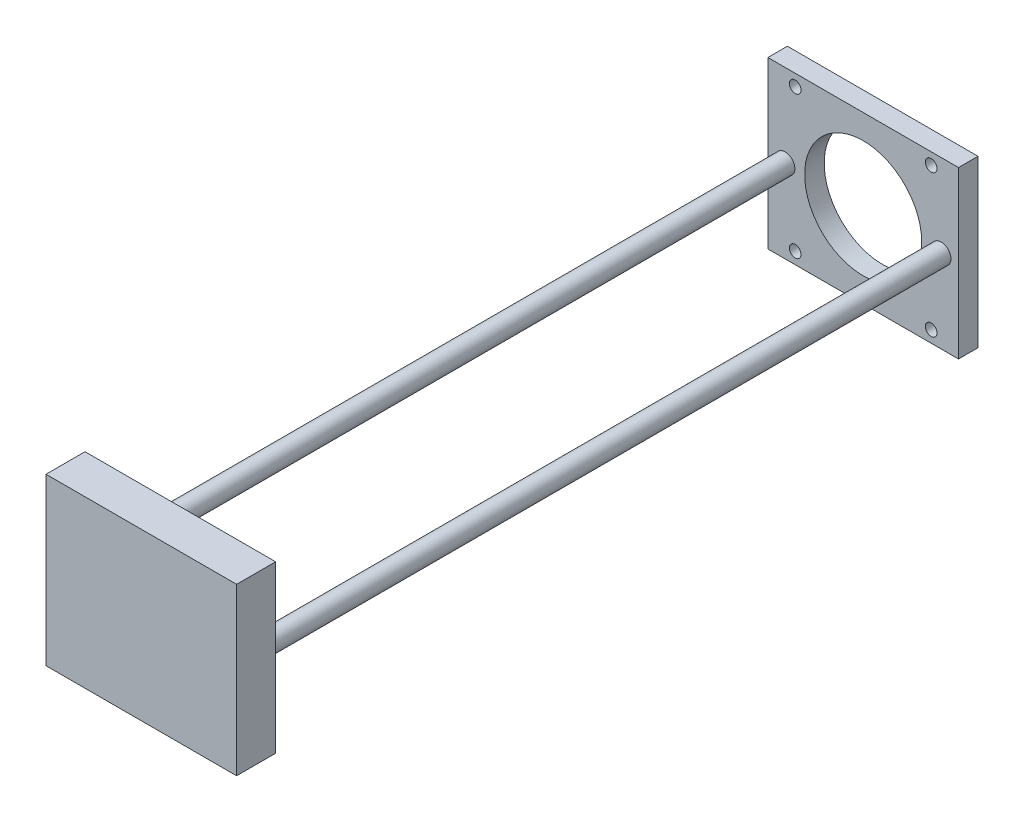
ISO-10303-21;
HEADER;
FILE_DESCRIPTION(('STEP AP214'),'2;1');
FILE_NAME('part.step','',(''),(''),'','','');
FILE_SCHEMA(('AUTOMOTIVE_DESIGN { 1 0 10303 214 1 1 1 1 }'));
ENDSEC;
DATA;
#1=APPLICATION_CONTEXT('core data for automotive mechanical design processes');
#2=APPLICATION_PROTOCOL_DEFINITION('international standard','automotive_design',2000,#1);
#3=PRODUCT_CONTEXT('',#1,'mechanical');
#4=PRODUCT('Part','Part','',(#3));
#5=PRODUCT_RELATED_PRODUCT_CATEGORY('part','',(#4));
#6=PRODUCT_DEFINITION_FORMATION('','',#4);
#7=PRODUCT_DEFINITION_CONTEXT('part definition',#1,'design');
#8=PRODUCT_DEFINITION('design','',#6,#7);
#9=PRODUCT_DEFINITION_SHAPE('','',#8);
#10=(LENGTH_UNIT() NAMED_UNIT(*) SI_UNIT(.MILLI.,.METRE.));
#11=(NAMED_UNIT(*) PLANE_ANGLE_UNIT() SI_UNIT($,.RADIAN.));
#12=(NAMED_UNIT(*) SI_UNIT($,.STERADIAN.) SOLID_ANGLE_UNIT());
#13=UNCERTAINTY_MEASURE_WITH_UNIT(LENGTH_MEASURE(1.E-05),#10,'distance_accuracy_value','');
#14=(GEOMETRIC_REPRESENTATION_CONTEXT(3) GLOBAL_UNCERTAINTY_ASSIGNED_CONTEXT((#13)) GLOBAL_UNIT_ASSIGNED_CONTEXT((#10,
#11,#12)) REPRESENTATION_CONTEXT('',''));
#15=CARTESIAN_POINT('',(0.,0.,0.));
#16=DIRECTION('',(0.,0.,1.));
#17=DIRECTION('',(1.,0.,0.));
#18=AXIS2_PLACEMENT_3D('',#15,#16,#17);
#19=CARTESIAN_POINT('',(0.,0.,10.));
#20=DIRECTION('',(0.,0.,1.));
#21=DIRECTION('',(1.,0.,0.));
#22=AXIS2_PLACEMENT_3D('',#19,#20,#21);
#23=PLANE('',#22);
#24=CARTESIAN_POINT('',(40.,0.,10.));
#25=DIRECTION('',(0.,0.,1.));
#26=DIRECTION('',(-1.,0.,0.));
#27=AXIS2_PLACEMENT_3D('',#24,#25,#26);
#28=CIRCLE('',#27,5.);
#29=CARTESIAN_POINT('',(35.,0.,10.));
#30=VERTEX_POINT('',#29);
#31=EDGE_CURVE('E146',#30,#30,#28,.T.);
#32=ORIENTED_EDGE('',*,*,#31,.F.);
#33=EDGE_LOOP('',(#32));
#34=FACE_BOUND('',#33,.T.);
#35=CARTESIAN_POINT('',(-40.,0.,10.));
#36=DIRECTION('',(0.,0.,1.));
#37=DIRECTION('',(1.,0.,0.));
#38=AXIS2_PLACEMENT_3D('',#35,#36,#37);
#39=CIRCLE('',#38,5.);
#40=CARTESIAN_POINT('',(-35.,0.,10.));
#41=VERTEX_POINT('',#40);
#42=EDGE_CURVE('E153',#41,#41,#39,.T.);
#43=ORIENTED_EDGE('',*,*,#42,.F.);
#44=EDGE_LOOP('',(#43));
#45=FACE_BOUND('',#44,.T.);
#46=CARTESIAN_POINT('',(34.85,-36.5,10.));
#47=DIRECTION('',(0.,0.,1.));
#48=DIRECTION('',(1.,0.,0.));
#49=AXIS2_PLACEMENT_3D('',#46,#47,#48);
#50=CIRCLE('',#49,3.);
#51=CARTESIAN_POINT('',(37.85,-36.5,10.));
#52=VERTEX_POINT('',#51);
#53=EDGE_CURVE('E167',#52,#52,#50,.T.);
#54=ORIENTED_EDGE('',*,*,#53,.F.);
#55=EDGE_LOOP('',(#54));
#56=FACE_BOUND('',#55,.T.);
#57=CARTESIAN_POINT('',(0.,0.,10.));
#58=DIRECTION('',(0.,0.,1.));
#59=DIRECTION('',(1.,0.,0.));
#60=AXIS2_PLACEMENT_3D('',#57,#58,#59);
#61=CIRCLE('',#60,30.);
#62=CARTESIAN_POINT('',(30.,0.,10.));
#63=VERTEX_POINT('',#62);
#64=EDGE_CURVE('E179',#63,#63,#61,.T.);
#65=ORIENTED_EDGE('',*,*,#64,.F.);
#66=EDGE_LOOP('',(#65));
#67=FACE_BOUND('',#66,.T.);
#68=DIRECTION('',(0.,-1.,0.));
#69=VECTOR('',#68,1.);
#70=CARTESIAN_POINT('',(-48.85,-42.5,10.));
#71=LINE('',#70,#69);
#72=CARTESIAN_POINT('',(-48.85,42.5,10.));
#73=VERTEX_POINT('',#72);
#74=CARTESIAN_POINT('',(-48.85,-42.5,10.));
#75=VERTEX_POINT('',#74);
#76=EDGE_CURVE('E191',#73,#75,#71,.T.);
#77=ORIENTED_EDGE('',*,*,#76,.T.);
#78=DIRECTION('',(1.,0.,0.));
#79=VECTOR('',#78,1.);
#80=CARTESIAN_POINT('',(48.85,-42.5,10.));
#81=LINE('',#80,#79);
#82=CARTESIAN_POINT('',(48.85,-42.5,10.));
#83=VERTEX_POINT('',#82);
#84=EDGE_CURVE('E91',#75,#83,#81,.T.);
#85=ORIENTED_EDGE('',*,*,#84,.T.);
#86=DIRECTION('',(0.,1.,0.));
#87=VECTOR('',#86,1.);
#88=CARTESIAN_POINT('',(48.85,-42.5,10.));
#89=LINE('',#88,#87);
#90=CARTESIAN_POINT('',(48.85,42.5,10.));
#91=VERTEX_POINT('',#90);
#92=EDGE_CURVE('E194',#83,#91,#89,.T.);
#93=ORIENTED_EDGE('',*,*,#92,.T.);
#94=DIRECTION('',(-1.,0.,0.));
#95=VECTOR('',#94,1.);
#96=CARTESIAN_POINT('',(48.85,42.5,10.));
#97=LINE('',#96,#95);
#98=EDGE_CURVE('E60',#91,#73,#97,.T.);
#99=ORIENTED_EDGE('',*,*,#98,.T.);
#100=EDGE_LOOP('',(#77,#85,#93,#99));
#101=FACE_BOUND('',#100,.T.);
#102=CARTESIAN_POINT('',(-34.85,36.5,10.));
#103=DIRECTION('',(0.,0.,1.));
#104=DIRECTION('',(1.,0.,0.));
#105=AXIS2_PLACEMENT_3D('',#102,#103,#104);
#106=CIRCLE('',#105,3.);
#107=CARTESIAN_POINT('',(-31.85,36.5,10.));
#108=VERTEX_POINT('',#107);
#109=EDGE_CURVE('E185',#108,#108,#106,.T.);
#110=ORIENTED_EDGE('',*,*,#109,.F.);
#111=EDGE_LOOP('',(#110));
#112=FACE_BOUND('',#111,.T.);
#113=CARTESIAN_POINT('',(34.8500000000001,36.5,10.));
#114=DIRECTION('',(0.,0.,1.));
#115=DIRECTION('',(-1.,0.,0.));
#116=AXIS2_PLACEMENT_3D('',#113,#114,#115);
#117=CIRCLE('',#116,3.);
#118=CARTESIAN_POINT('',(31.8500000000001,36.5,10.));
#119=VERTEX_POINT('',#118);
#120=EDGE_CURVE('E173',#119,#119,#117,.T.);
#121=ORIENTED_EDGE('',*,*,#120,.F.);
#122=EDGE_LOOP('',(#121));
#123=FACE_BOUND('',#122,.T.);
#124=CARTESIAN_POINT('',(-34.85,-36.5,10.));
#125=DIRECTION('',(0.,0.,1.));
#126=DIRECTION('',(-1.,0.,0.));
#127=AXIS2_PLACEMENT_3D('',#124,#125,#126);
#128=CIRCLE('',#127,3.);
#129=CARTESIAN_POINT('',(-37.85,-36.5,10.));
#130=VERTEX_POINT('',#129);
#131=EDGE_CURVE('E161',#130,#130,#128,.T.);
#132=ORIENTED_EDGE('',*,*,#131,.F.);
#133=EDGE_LOOP('',(#132));
#134=FACE_BOUND('',#133,.T.);
#135=ADVANCED_FACE('F43',(#34,#45,#56,#67,#101,#112,#123,#134),#23,.T.);
#136=CARTESIAN_POINT('',(0.,0.,0.));
#137=DIRECTION('',(0.,0.,1.));
#138=DIRECTION('',(1.,0.,0.));
#139=AXIS2_PLACEMENT_3D('',#136,#137,#138);
#140=PLANE('',#139);
#141=DIRECTION('',(0.,-1.,0.));
#142=VECTOR('',#141,1.);
#143=CARTESIAN_POINT('',(-48.85,-42.5,0.));
#144=LINE('',#143,#142);
#145=CARTESIAN_POINT('',(-48.85,42.5,0.));
#146=VERTEX_POINT('',#145);
#147=CARTESIAN_POINT('',(-48.85,-42.5,0.));
#148=VERTEX_POINT('',#147);
#149=EDGE_CURVE('E188',#146,#148,#144,.T.);
#150=ORIENTED_EDGE('',*,*,#149,.F.);
#151=DIRECTION('',(-1.,0.,0.));
#152=VECTOR('',#151,1.);
#153=CARTESIAN_POINT('',(48.85,42.5,0.));
#154=LINE('',#153,#152);
#155=CARTESIAN_POINT('',(48.85,42.5,0.));
#156=VERTEX_POINT('',#155);
#157=EDGE_CURVE('E84',#156,#146,#154,.T.);
#158=ORIENTED_EDGE('',*,*,#157,.F.);
#159=DIRECTION('',(0.,1.,0.));
#160=VECTOR('',#159,1.);
#161=CARTESIAN_POINT('',(48.85,-42.5,0.));
#162=LINE('',#161,#160);
#163=CARTESIAN_POINT('',(48.85,-42.5,0.));
#164=VERTEX_POINT('',#163);
#165=EDGE_CURVE('E78',#164,#156,#162,.T.);
#166=ORIENTED_EDGE('',*,*,#165,.F.);
#167=DIRECTION('',(1.,0.,0.));
#168=VECTOR('',#167,1.);
#169=CARTESIAN_POINT('',(48.85,-42.5,0.));
#170=LINE('',#169,#168);
#171=EDGE_CURVE('E200',#148,#164,#170,.T.);
#172=ORIENTED_EDGE('',*,*,#171,.F.);
#173=EDGE_LOOP('',(#150,#158,#166,#172));
#174=FACE_BOUND('',#173,.T.);
#175=CARTESIAN_POINT('',(-34.85,36.5,0.));
#176=DIRECTION('',(0.,0.,1.));
#177=DIRECTION('',(1.,0.,0.));
#178=AXIS2_PLACEMENT_3D('',#175,#176,#177);
#179=CIRCLE('',#178,3.);
#180=CARTESIAN_POINT('',(-31.85,36.5,0.));
#181=VERTEX_POINT('',#180);
#182=EDGE_CURVE('E182',#181,#181,#179,.T.);
#183=ORIENTED_EDGE('',*,*,#182,.T.);
#184=EDGE_LOOP('',(#183));
#185=FACE_BOUND('',#184,.T.);
#186=CARTESIAN_POINT('',(0.,0.,0.));
#187=DIRECTION('',(0.,0.,1.));
#188=DIRECTION('',(1.,0.,0.));
#189=AXIS2_PLACEMENT_3D('',#186,#187,#188);
#190=CIRCLE('',#189,30.);
#191=CARTESIAN_POINT('',(30.,0.,0.));
#192=VERTEX_POINT('',#191);
#193=EDGE_CURVE('E176',#192,#192,#190,.T.);
#194=ORIENTED_EDGE('',*,*,#193,.T.);
#195=EDGE_LOOP('',(#194));
#196=FACE_BOUND('',#195,.T.);
#197=CARTESIAN_POINT('',(34.8500000000001,36.5,0.));
#198=DIRECTION('',(0.,0.,1.));
#199=DIRECTION('',(-1.,0.,0.));
#200=AXIS2_PLACEMENT_3D('',#197,#198,#199);
#201=CIRCLE('',#200,3.);
#202=CARTESIAN_POINT('',(31.8500000000001,36.5,0.));
#203=VERTEX_POINT('',#202);
#204=EDGE_CURVE('E170',#203,#203,#201,.T.);
#205=ORIENTED_EDGE('',*,*,#204,.T.);
#206=EDGE_LOOP('',(#205));
#207=FACE_BOUND('',#206,.T.);
#208=CARTESIAN_POINT('',(34.85,-36.5,0.));
#209=DIRECTION('',(0.,0.,1.));
#210=DIRECTION('',(1.,0.,0.));
#211=AXIS2_PLACEMENT_3D('',#208,#209,#210);
#212=CIRCLE('',#211,3.);
#213=CARTESIAN_POINT('',(37.85,-36.5,0.));
#214=VERTEX_POINT('',#213);
#215=EDGE_CURVE('E164',#214,#214,#212,.T.);
#216=ORIENTED_EDGE('',*,*,#215,.T.);
#217=EDGE_LOOP('',(#216));
#218=FACE_BOUND('',#217,.T.);
#219=CARTESIAN_POINT('',(-34.85,-36.5,0.));
#220=DIRECTION('',(0.,0.,1.));
#221=DIRECTION('',(-1.,0.,0.));
#222=AXIS2_PLACEMENT_3D('',#219,#220,#221);
#223=CIRCLE('',#222,3.);
#224=CARTESIAN_POINT('',(-37.85,-36.5,0.));
#225=VERTEX_POINT('',#224);
#226=EDGE_CURVE('E158',#225,#225,#223,.T.);
#227=ORIENTED_EDGE('',*,*,#226,.T.);
#228=EDGE_LOOP('',(#227));
#229=FACE_BOUND('',#228,.T.);
#230=ADVANCED_FACE('F210',(#174,#185,#196,#207,#218,#229),#140,.F.);
#231=CARTESIAN_POINT('',(-48.85,-42.5,10.));
#232=DIRECTION('',(1.,0.,0.));
#233=DIRECTION('',(0.,0.,-1.));
#234=AXIS2_PLACEMENT_3D('',#231,#232,#233);
#235=PLANE('',#234);
#236=ORIENTED_EDGE('',*,*,#149,.T.);
#237=DIRECTION('',(0.,0.,-1.));
#238=VECTOR('',#237,1.);
#239=CARTESIAN_POINT('',(-48.85,-42.5,10.));
#240=LINE('',#239,#238);
#241=EDGE_CURVE('E11',#75,#148,#240,.T.);
#242=ORIENTED_EDGE('',*,*,#241,.F.);
#243=ORIENTED_EDGE('',*,*,#76,.F.);
#244=DIRECTION('',(0.,0.,-1.));
#245=VECTOR('',#244,1.);
#246=CARTESIAN_POINT('',(-48.85,42.5,10.));
#247=LINE('',#246,#245);
#248=EDGE_CURVE('E197',#73,#146,#247,.T.);
#249=ORIENTED_EDGE('',*,*,#248,.T.);
#250=EDGE_LOOP('',(#236,#242,#243,#249));
#251=FACE_BOUND('',#250,.T.);
#252=ADVANCED_FACE('F45',(#251),#235,.F.);
#253=CARTESIAN_POINT('',(48.85,-42.5,10.));
#254=DIRECTION('',(0.,1.,0.));
#255=DIRECTION('',(-1.,0.,0.));
#256=AXIS2_PLACEMENT_3D('',#253,#254,#255);
#257=PLANE('',#256);
#258=ORIENTED_EDGE('',*,*,#171,.T.);
#259=DIRECTION('',(0.,0.,-1.));
#260=VECTOR('',#259,1.);
#261=CARTESIAN_POINT('',(48.85,-42.5,10.));
#262=LINE('',#261,#260);
#263=EDGE_CURVE('E52',#83,#164,#262,.T.);
#264=ORIENTED_EDGE('',*,*,#263,.F.);
#265=ORIENTED_EDGE('',*,*,#84,.F.);
#266=ORIENTED_EDGE('',*,*,#241,.T.);
#267=EDGE_LOOP('',(#258,#264,#265,#266));
#268=FACE_BOUND('',#267,.T.);
#269=ADVANCED_FACE('F226',(#268),#257,.F.);
#270=CARTESIAN_POINT('',(48.85,-42.5,10.));
#271=DIRECTION('',(-1.,0.,0.));
#272=DIRECTION('',(0.,0.,1.));
#273=AXIS2_PLACEMENT_3D('',#270,#271,#272);
#274=PLANE('',#273);
#275=ORIENTED_EDGE('',*,*,#165,.T.);
#276=DIRECTION('',(0.,0.,-1.));
#277=VECTOR('',#276,1.);
#278=CARTESIAN_POINT('',(48.85,42.5,10.));
#279=LINE('',#278,#277);
#280=EDGE_CURVE('E205',#91,#156,#279,.T.);
#281=ORIENTED_EDGE('',*,*,#280,.F.);
#282=ORIENTED_EDGE('',*,*,#92,.F.);
#283=ORIENTED_EDGE('',*,*,#263,.T.);
#284=EDGE_LOOP('',(#275,#281,#282,#283));
#285=FACE_BOUND('',#284,.T.);
#286=ADVANCED_FACE('F207',(#285),#274,.F.);
#287=CARTESIAN_POINT('',(48.85,42.5,10.));
#288=DIRECTION('',(0.,-1.,0.));
#289=DIRECTION('',(1.,0.,0.));
#290=AXIS2_PLACEMENT_3D('',#287,#288,#289);
#291=PLANE('',#290);
#292=ORIENTED_EDGE('',*,*,#157,.T.);
#293=ORIENTED_EDGE('',*,*,#248,.F.);
#294=ORIENTED_EDGE('',*,*,#98,.F.);
#295=ORIENTED_EDGE('',*,*,#280,.T.);
#296=EDGE_LOOP('',(#292,#293,#294,#295));
#297=FACE_BOUND('',#296,.T.);
#298=ADVANCED_FACE('F215',(#297),#291,.F.);
#299=CARTESIAN_POINT('',(-34.85,36.5,10.));
#300=DIRECTION('',(0.,0.,-1.));
#301=DIRECTION('',(-1.,0.,0.));
#302=AXIS2_PLACEMENT_3D('',#299,#300,#301);
#303=CYLINDRICAL_SURFACE('',#302,3.);
#304=ORIENTED_EDGE('',*,*,#109,.T.);
#305=EDGE_LOOP('',(#304));
#306=FACE_BOUND('',#305,.T.);
#307=ORIENTED_EDGE('',*,*,#182,.F.);
#308=EDGE_LOOP('',(#307));
#309=FACE_BOUND('',#308,.T.);
#310=ADVANCED_FACE('F217',(#306,#309),#303,.F.);
#311=CARTESIAN_POINT('',(0.,0.,10.));
#312=DIRECTION('',(0.,0.,-1.));
#313=DIRECTION('',(-1.,0.,0.));
#314=AXIS2_PLACEMENT_3D('',#311,#312,#313);
#315=CYLINDRICAL_SURFACE('',#314,30.);
#316=ORIENTED_EDGE('',*,*,#64,.T.);
#317=EDGE_LOOP('',(#316));
#318=FACE_BOUND('',#317,.T.);
#319=ORIENTED_EDGE('',*,*,#193,.F.);
#320=EDGE_LOOP('',(#319));
#321=FACE_BOUND('',#320,.T.);
#322=ADVANCED_FACE('F223',(#318,#321),#315,.F.);
#323=CARTESIAN_POINT('',(34.8500000000001,36.5,10.));
#324=DIRECTION('',(0.,0.,-1.));
#325=DIRECTION('',(-1.,0.,0.));
#326=AXIS2_PLACEMENT_3D('',#323,#324,#325);
#327=CYLINDRICAL_SURFACE('',#326,3.);
#328=ORIENTED_EDGE('',*,*,#120,.T.);
#329=EDGE_LOOP('',(#328));
#330=FACE_BOUND('',#329,.T.);
#331=ORIENTED_EDGE('',*,*,#204,.F.);
#332=EDGE_LOOP('',(#331));
#333=FACE_BOUND('',#332,.T.);
#334=ADVANCED_FACE('F240',(#330,#333),#327,.F.);
#335=CARTESIAN_POINT('',(34.85,-36.5,10.));
#336=DIRECTION('',(0.,0.,-1.));
#337=DIRECTION('',(-1.,0.,0.));
#338=AXIS2_PLACEMENT_3D('',#335,#336,#337);
#339=CYLINDRICAL_SURFACE('',#338,3.);
#340=ORIENTED_EDGE('',*,*,#53,.T.);
#341=EDGE_LOOP('',(#340));
#342=FACE_BOUND('',#341,.T.);
#343=ORIENTED_EDGE('',*,*,#215,.F.);
#344=EDGE_LOOP('',(#343));
#345=FACE_BOUND('',#344,.T.);
#346=ADVANCED_FACE('F244',(#342,#345),#339,.F.);
#347=CARTESIAN_POINT('',(-34.85,-36.5,10.));
#348=DIRECTION('',(0.,0.,-1.));
#349=DIRECTION('',(-1.,0.,0.));
#350=AXIS2_PLACEMENT_3D('',#347,#348,#349);
#351=CYLINDRICAL_SURFACE('',#350,3.);
#352=ORIENTED_EDGE('',*,*,#131,.T.);
#353=EDGE_LOOP('',(#352));
#354=FACE_BOUND('',#353,.T.);
#355=ORIENTED_EDGE('',*,*,#226,.F.);
#356=EDGE_LOOP('',(#355));
#357=FACE_BOUND('',#356,.T.);
#358=ADVANCED_FACE('F248',(#354,#357),#351,.F.);
#359=CARTESIAN_POINT('',(-40.,0.,360.));
#360=DIRECTION('',(0.,0.,-1.));
#361=DIRECTION('',(-1.,0.,0.));
#362=AXIS2_PLACEMENT_3D('',#359,#360,#361);
#363=CYLINDRICAL_SURFACE('',#362,5.);
#364=CARTESIAN_POINT('',(-40.,0.,360.));
#365=DIRECTION('',(0.,0.,1.));
#366=DIRECTION('',(1.,0.,0.));
#367=AXIS2_PLACEMENT_3D('',#364,#365,#366);
#368=CIRCLE('',#367,5.);
#369=CARTESIAN_POINT('',(-35.,0.,360.));
#370=VERTEX_POINT('',#369);
#371=EDGE_CURVE('E155',#370,#370,#368,.T.);
#372=ORIENTED_EDGE('',*,*,#371,.F.);
#373=EDGE_LOOP('',(#372));
#374=FACE_BOUND('',#373,.T.);
#375=ORIENTED_EDGE('',*,*,#42,.T.);
#376=EDGE_LOOP('',(#375));
#377=FACE_BOUND('',#376,.T.);
#378=ADVANCED_FACE('F252',(#374,#377),#363,.T.);
#379=CARTESIAN_POINT('',(40.,0.,360.));
#380=DIRECTION('',(0.,0.,-1.));
#381=DIRECTION('',(-1.,0.,0.));
#382=AXIS2_PLACEMENT_3D('',#379,#380,#381);
#383=CYLINDRICAL_SURFACE('',#382,5.);
#384=CARTESIAN_POINT('',(40.,0.,360.));
#385=DIRECTION('',(0.,0.,1.));
#386=DIRECTION('',(-1.,0.,0.));
#387=AXIS2_PLACEMENT_3D('',#384,#385,#386);
#388=CIRCLE('',#387,5.);
#389=CARTESIAN_POINT('',(35.,0.,360.));
#390=VERTEX_POINT('',#389);
#391=EDGE_CURVE('E143',#390,#390,#388,.T.);
#392=ORIENTED_EDGE('',*,*,#391,.F.);
#393=EDGE_LOOP('',(#392));
#394=FACE_BOUND('',#393,.T.);
#395=ORIENTED_EDGE('',*,*,#31,.T.);
#396=EDGE_LOOP('',(#395));
#397=FACE_BOUND('',#396,.T.);
#398=ADVANCED_FACE('F256',(#394,#397),#383,.T.);
#399=CARTESIAN_POINT('',(-48.85,42.5,380.));
#400=DIRECTION('',(1.,0.,0.));
#401=DIRECTION('',(0.,0.,-1.));
#402=AXIS2_PLACEMENT_3D('',#399,#400,#401);
#403=PLANE('',#402);
#404=DIRECTION('',(0.,-1.,0.));
#405=VECTOR('',#404,1.);
#406=CARTESIAN_POINT('',(-48.85,42.5,360.));
#407=LINE('',#406,#405);
#408=CARTESIAN_POINT('',(-48.85,42.5,360.));
#409=VERTEX_POINT('',#408);
#410=CARTESIAN_POINT('',(-48.85,-42.5,360.));
#411=VERTEX_POINT('',#410);
#412=EDGE_CURVE('E142',#409,#411,#407,.T.);
#413=ORIENTED_EDGE('',*,*,#412,.T.);
#414=DIRECTION('',(0.,0.,-1.));
#415=VECTOR('',#414,1.);
#416=CARTESIAN_POINT('',(-48.85,-42.5,380.));
#417=LINE('',#416,#415);
#418=CARTESIAN_POINT('',(-48.85,-42.5,380.));
#419=VERTEX_POINT('',#418);
#420=EDGE_CURVE('E122',#419,#411,#417,.T.);
#421=ORIENTED_EDGE('',*,*,#420,.F.);
#422=DIRECTION('',(0.,-1.,0.));
#423=VECTOR('',#422,1.);
#424=CARTESIAN_POINT('',(-48.85,42.5,380.));
#425=LINE('',#424,#423);
#426=CARTESIAN_POINT('',(-48.85,42.5,380.));
#427=VERTEX_POINT('',#426);
#428=EDGE_CURVE('E129',#427,#419,#425,.T.);
#429=ORIENTED_EDGE('',*,*,#428,.F.);
#430=DIRECTION('',(0.,0.,-1.));
#431=VECTOR('',#430,1.);
#432=CARTESIAN_POINT('',(-48.85,42.5,380.));
#433=LINE('',#432,#431);
#434=EDGE_CURVE('E443',#427,#409,#433,.T.);
#435=ORIENTED_EDGE('',*,*,#434,.T.);
#436=EDGE_LOOP('',(#413,#421,#429,#435));
#437=FACE_BOUND('',#436,.T.);
#438=ADVANCED_FACE('F140',(#437),#403,.F.);
#439=CARTESIAN_POINT('',(-48.85,-42.5,380.));
#440=DIRECTION('',(0.,1.,0.));
#441=DIRECTION('',(0.,0.,1.));
#442=AXIS2_PLACEMENT_3D('',#439,#440,#441);
#443=PLANE('',#442);
#444=DIRECTION('',(1.,0.,0.));
#445=VECTOR('',#444,1.);
#446=CARTESIAN_POINT('',(-48.85,-42.5,360.));
#447=LINE('',#446,#445);
#448=CARTESIAN_POINT('',(48.85,-42.5,360.));
#449=VERTEX_POINT('',#448);
#450=EDGE_CURVE('E434',#411,#449,#447,.T.);
#451=ORIENTED_EDGE('',*,*,#450,.T.);
#452=DIRECTION('',(0.,0.,-1.));
#453=VECTOR('',#452,1.);
#454=CARTESIAN_POINT('',(48.85,-42.5,380.));
#455=LINE('',#454,#453);
#456=CARTESIAN_POINT('',(48.85,-42.5,380.));
#457=VERTEX_POINT('',#456);
#458=EDGE_CURVE('E125',#457,#449,#455,.T.);
#459=ORIENTED_EDGE('',*,*,#458,.F.);
#460=DIRECTION('',(1.,0.,0.));
#461=VECTOR('',#460,1.);
#462=CARTESIAN_POINT('',(-48.85,-42.5,380.));
#463=LINE('',#462,#461);
#464=EDGE_CURVE('E118',#419,#457,#463,.T.);
#465=ORIENTED_EDGE('',*,*,#464,.F.);
#466=ORIENTED_EDGE('',*,*,#420,.T.);
#467=EDGE_LOOP('',(#451,#459,#465,#466));
#468=FACE_BOUND('',#467,.T.);
#469=ADVANCED_FACE('F120',(#468),#443,.F.);
#470=CARTESIAN_POINT('',(48.85,42.5,380.));
#471=DIRECTION('',(-1.,0.,0.));
#472=DIRECTION('',(0.,0.,1.));
#473=AXIS2_PLACEMENT_3D('',#470,#471,#472);
#474=PLANE('',#473);
#475=DIRECTION('',(0.,1.,0.));
#476=VECTOR('',#475,1.);
#477=CARTESIAN_POINT('',(48.85,42.5,360.));
#478=LINE('',#477,#476);
#479=CARTESIAN_POINT('',(48.85,42.5,360.));
#480=VERTEX_POINT('',#479);
#481=EDGE_CURVE('E436',#449,#480,#478,.T.);
#482=ORIENTED_EDGE('',*,*,#481,.T.);
#483=DIRECTION('',(0.,0.,-1.));
#484=VECTOR('',#483,1.);
#485=CARTESIAN_POINT('',(48.85,42.5,380.));
#486=LINE('',#485,#484);
#487=CARTESIAN_POINT('',(48.85,42.5,380.));
#488=VERTEX_POINT('',#487);
#489=EDGE_CURVE('E148',#488,#480,#486,.T.);
#490=ORIENTED_EDGE('',*,*,#489,.F.);
#491=DIRECTION('',(0.,1.,0.));
#492=VECTOR('',#491,1.);
#493=CARTESIAN_POINT('',(48.85,42.5,380.));
#494=LINE('',#493,#492);
#495=EDGE_CURVE('E128',#457,#488,#494,.T.);
#496=ORIENTED_EDGE('',*,*,#495,.F.);
#497=ORIENTED_EDGE('',*,*,#458,.T.);
#498=EDGE_LOOP('',(#482,#490,#496,#497));
#499=FACE_BOUND('',#498,.T.);
#500=ADVANCED_FACE('F265',(#499),#474,.F.);
#501=CARTESIAN_POINT('',(-48.85,42.5,380.));
#502=DIRECTION('',(0.,-1.,0.));
#503=DIRECTION('',(0.,0.,-1.));
#504=AXIS2_PLACEMENT_3D('',#501,#502,#503);
#505=PLANE('',#504);
#506=DIRECTION('',(-1.,0.,0.));
#507=VECTOR('',#506,1.);
#508=CARTESIAN_POINT('',(-48.85,42.5,360.));
#509=LINE('',#508,#507);
#510=EDGE_CURVE('E138',#480,#409,#509,.T.);
#511=ORIENTED_EDGE('',*,*,#510,.T.);
#512=ORIENTED_EDGE('',*,*,#434,.F.);
#513=DIRECTION('',(-1.,0.,0.));
#514=VECTOR('',#513,1.);
#515=CARTESIAN_POINT('',(-48.85,42.5,380.));
#516=LINE('',#515,#514);
#517=EDGE_CURVE('E134',#488,#427,#516,.T.);
#518=ORIENTED_EDGE('',*,*,#517,.F.);
#519=ORIENTED_EDGE('',*,*,#489,.T.);
#520=EDGE_LOOP('',(#511,#512,#518,#519));
#521=FACE_BOUND('',#520,.T.);
#522=ADVANCED_FACE('F268',(#521),#505,.F.);
#523=CARTESIAN_POINT('',(0.,0.,380.));
#524=DIRECTION('',(0.,0.,1.));
#525=DIRECTION('',(1.,0.,0.));
#526=AXIS2_PLACEMENT_3D('',#523,#524,#525);
#527=PLANE('',#526);
#528=ORIENTED_EDGE('',*,*,#428,.T.);
#529=ORIENTED_EDGE('',*,*,#464,.T.);
#530=ORIENTED_EDGE('',*,*,#495,.T.);
#531=ORIENTED_EDGE('',*,*,#517,.T.);
#532=EDGE_LOOP('',(#528,#529,#530,#531));
#533=FACE_BOUND('',#532,.T.);
#534=ADVANCED_FACE('F132',(#533),#527,.T.);
#535=CARTESIAN_POINT('',(0.,0.,360.));
#536=DIRECTION('',(0.,0.,1.));
#537=DIRECTION('',(1.,0.,0.));
#538=AXIS2_PLACEMENT_3D('',#535,#536,#537);
#539=PLANE('',#538);
#540=ORIENTED_EDGE('',*,*,#371,.T.);
#541=EDGE_LOOP('',(#540));
#542=FACE_BOUND('',#541,.T.);
#543=ORIENTED_EDGE('',*,*,#391,.T.);
#544=EDGE_LOOP('',(#543));
#545=FACE_BOUND('',#544,.T.);
#546=ORIENTED_EDGE('',*,*,#412,.F.);
#547=ORIENTED_EDGE('',*,*,#510,.F.);
#548=ORIENTED_EDGE('',*,*,#481,.F.);
#549=ORIENTED_EDGE('',*,*,#450,.F.);
#550=EDGE_LOOP('',(#546,#547,#548,#549));
#551=FACE_BOUND('',#550,.T.);
#552=ADVANCED_FACE('F273',(#542,#545,#551),#539,.F.);
#553=CLOSED_SHELL('',(#135,#230,#252,#269,#286,#298,#310,#322,#334,#346,#358,#378,#398,#438,
#469,#500,#522,#534,#552));
#554=MANIFOLD_SOLID_BREP('B2',#553);
#555=ADVANCED_BREP_SHAPE_REPRESENTATION('',(#18,#554),#14);
#556=SHAPE_DEFINITION_REPRESENTATION(#9,#555);
ENDSEC;
END-ISO-10303-21;
